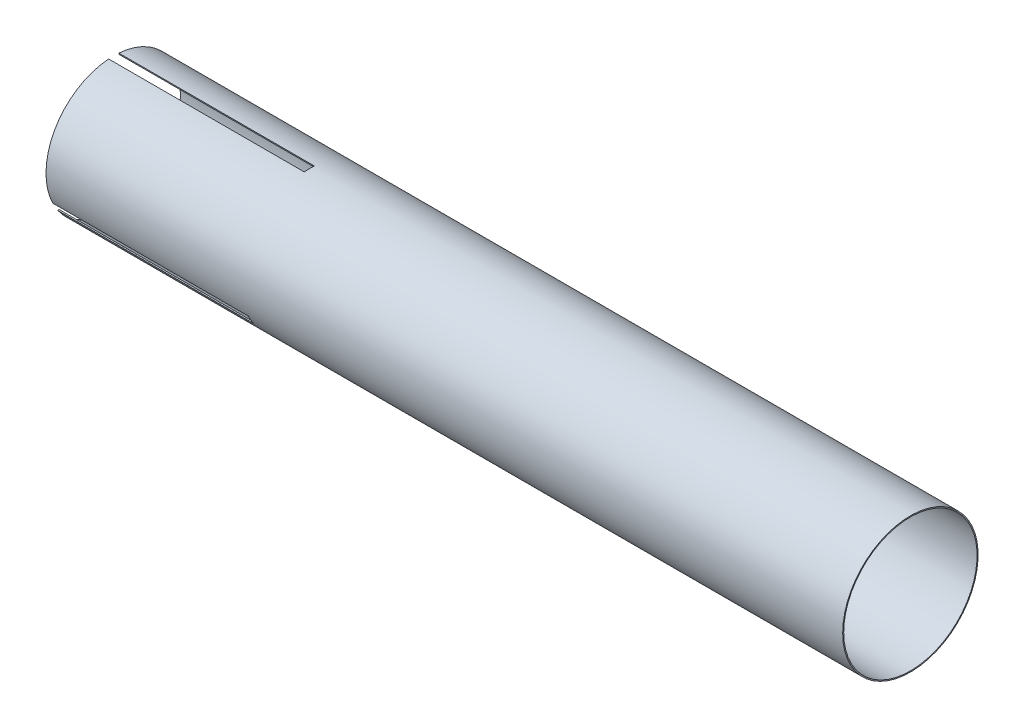
ISO-10303-21;
HEADER;
FILE_DESCRIPTION(('STEP AP214'),'2;1');
FILE_NAME('part.step','',(''),(''),'','','');
FILE_SCHEMA(('AUTOMOTIVE_DESIGN { 1 0 10303 214 1 1 1 1 }'));
ENDSEC;
DATA;
#1=APPLICATION_CONTEXT('core data for automotive mechanical design processes');
#2=APPLICATION_PROTOCOL_DEFINITION('international standard','automotive_design',2000,#1);
#3=PRODUCT_CONTEXT('',#1,'mechanical');
#4=PRODUCT('Part','Part','',(#3));
#5=PRODUCT_RELATED_PRODUCT_CATEGORY('part','',(#4));
#6=PRODUCT_DEFINITION_FORMATION('','',#4);
#7=PRODUCT_DEFINITION_CONTEXT('part definition',#1,'design');
#8=PRODUCT_DEFINITION('design','',#6,#7);
#9=PRODUCT_DEFINITION_SHAPE('','',#8);
#10=(LENGTH_UNIT() NAMED_UNIT(*) SI_UNIT(.MILLI.,.METRE.));
#11=(NAMED_UNIT(*) PLANE_ANGLE_UNIT() SI_UNIT($,.RADIAN.));
#12=(NAMED_UNIT(*) SI_UNIT($,.STERADIAN.) SOLID_ANGLE_UNIT());
#13=UNCERTAINTY_MEASURE_WITH_UNIT(LENGTH_MEASURE(1.E-05),#10,'distance_accuracy_value','');
#14=(GEOMETRIC_REPRESENTATION_CONTEXT(3) GLOBAL_UNCERTAINTY_ASSIGNED_CONTEXT((#13)) GLOBAL_UNIT_ASSIGNED_CONTEXT((#10,
#11,#12)) REPRESENTATION_CONTEXT('',''));
#15=CARTESIAN_POINT('',(0.,0.,0.));
#16=DIRECTION('',(0.,0.,1.));
#17=DIRECTION('',(1.,0.,0.));
#18=AXIS2_PLACEMENT_3D('',#15,#16,#17);
#19=CARTESIAN_POINT('',(0.,76.182,0.));
#20=DIRECTION('',(1.,0.,0.));
#21=DIRECTION('',(0.,0.,-1.));
#22=AXIS2_PLACEMENT_3D('',#19,#20,#21);
#23=PLANE('',#22);
#24=DIRECTION('',(0.,0.500000000000004,0.866025403784436));
#25=VECTOR('',#24,1.);
#26=CARTESIAN_POINT('',(0.,-57.0051254986801,-87.2537736555529));
#27=LINE('',#26,#25);
#28=CARTESIAN_POINT('',(0.,-42.9545388300949,-62.9174436694139));
#29=VERTEX_POINT('',#28);
#30=CARTESIAN_POINT('',(0.,-42.361826833089,-61.890836376344));
#31=VERTEX_POINT('',#30);
#32=EDGE_CURVE('E203',#29,#31,#27,.T.);
#33=ORIENTED_EDGE('',*,*,#32,.F.);
#34=CARTESIAN_POINT('',(0.,0.,0.));
#35=DIRECTION('',(-1.,0.,0.));
#36=DIRECTION('',(0.,0.,1.));
#37=AXIS2_PLACEMENT_3D('',#34,#35,#36);
#38=CIRCLE('',#37,76.182);
#39=CARTESIAN_POINT('',(0.,-42.954538830094,62.9174436694145));
#40=VERTEX_POINT('',#39);
#41=EDGE_CURVE('E147',#29,#40,#38,.T.);
#42=ORIENTED_EDGE('',*,*,#41,.T.);
#43=DIRECTION('',(0.,0.499999999999991,-0.866025403784444));
#44=VECTOR('',#43,1.);
#45=CARTESIAN_POINT('',(0.,-57.0051254986785,87.2537736555534));
#46=LINE('',#45,#44);
#47=CARTESIAN_POINT('',(0.,-42.3618268330881,61.8908363763446));
#48=VERTEX_POINT('',#47);
#49=EDGE_CURVE('E210',#40,#48,#46,.T.);
#50=ORIENTED_EDGE('',*,*,#49,.T.);
#51=CARTESIAN_POINT('',(0.,0.,0.));
#52=DIRECTION('',(-1.,0.,0.));
#53=DIRECTION('',(0.,0.,1.));
#54=AXIS2_PLACEMENT_3D('',#51,#52,#53);
#55=CIRCLE('',#54,75.);
#56=EDGE_CURVE('E176',#31,#48,#55,.T.);
#57=ORIENTED_EDGE('',*,*,#56,.F.);
#58=EDGE_LOOP('',(#33,#42,#50,#57));
#59=FACE_BOUND('',#58,.T.);
#60=ADVANCED_FACE('F37',(#59),#23,.F.);
#61=DIRECTION('',(0.,0.500000000000004,0.866025403784436));
#62=VECTOR('',#61,1.);
#63=CARTESIAN_POINT('',(0.,-47.0614218124272,-92.994773655553));
#64=LINE('',#63,#62);
#65=CARTESIAN_POINT('',(0.,-33.010835143842,-68.6584436694139));
#66=VERTEX_POINT('',#65);
#67=CARTESIAN_POINT('',(0.,-32.4181231468361,-67.631836376344));
#68=VERTEX_POINT('',#67);
#69=EDGE_CURVE('E218',#66,#68,#64,.T.);
#70=ORIENTED_EDGE('',*,*,#69,.T.);
#71=CARTESIAN_POINT('',(0.,74.7799499799244,-5.741));
#72=VERTEX_POINT('',#71);
#73=EDGE_CURVE('E172',#72,#68,#55,.T.);
#74=ORIENTED_EDGE('',*,*,#73,.F.);
#75=DIRECTION('',(0.,-1.,0.));
#76=VECTOR('',#75,1.);
#77=CARTESIAN_POINT('',(0.,76.182,-5.741));
#78=LINE('',#77,#76);
#79=CARTESIAN_POINT('',(0.,75.9653739739363,-5.741));
#80=VERTEX_POINT('',#79);
#81=EDGE_CURVE('E230',#80,#72,#78,.T.);
#82=ORIENTED_EDGE('',*,*,#81,.F.);
#83=EDGE_CURVE('E150',#80,#66,#38,.T.);
#84=ORIENTED_EDGE('',*,*,#83,.T.);
#85=EDGE_LOOP('',(#70,#74,#82,#84));
#86=FACE_BOUND('',#85,.T.);
#87=ADVANCED_FACE('F259',(#86),#23,.F.);
#88=DIRECTION('',(0.,0.499999999999991,-0.866025403784444));
#89=VECTOR('',#88,1.);
#90=CARTESIAN_POINT('',(0.,-47.0614218124255,92.9947736555533));
#91=LINE('',#90,#89);
#92=CARTESIAN_POINT('',(0.,-33.010835143841,68.6584436694144));
#93=VERTEX_POINT('',#92);
#94=CARTESIAN_POINT('',(0.,-32.4181231468351,67.6318363763445));
#95=VERTEX_POINT('',#94);
#96=EDGE_CURVE('E126',#93,#95,#91,.T.);
#97=ORIENTED_EDGE('',*,*,#96,.F.);
#98=CARTESIAN_POINT('',(0.,75.9653739739363,5.741));
#99=VERTEX_POINT('',#98);
#100=EDGE_CURVE('E138',#93,#99,#38,.T.);
#101=ORIENTED_EDGE('',*,*,#100,.T.);
#102=DIRECTION('',(0.,-1.,0.));
#103=VECTOR('',#102,1.);
#104=CARTESIAN_POINT('',(0.,76.182,5.741));
#105=LINE('',#104,#103);
#106=CARTESIAN_POINT('',(0.,74.7799499799244,5.741));
#107=VERTEX_POINT('',#106);
#108=EDGE_CURVE('E238',#99,#107,#105,.T.);
#109=ORIENTED_EDGE('',*,*,#108,.T.);
#110=EDGE_CURVE('E140',#95,#107,#55,.T.);
#111=ORIENTED_EDGE('',*,*,#110,.F.);
#112=EDGE_LOOP('',(#97,#101,#109,#111));
#113=FACE_BOUND('',#112,.T.);
#114=ADVANCED_FACE('F136',(#113),#23,.F.);
#115=CARTESIAN_POINT('',(0.,0.,0.));
#116=DIRECTION('',(-1.,0.,0.));
#117=DIRECTION('',(0.,0.,1.));
#118=AXIS2_PLACEMENT_3D('',#115,#116,#117);
#119=CYLINDRICAL_SURFACE('',#118,75.);
#120=CARTESIAN_POINT('',(896.,0.,0.));
#121=DIRECTION('',(-1.,0.,0.));
#122=DIRECTION('',(0.,0.,1.));
#123=AXIS2_PLACEMENT_3D('',#120,#121,#122);
#124=CIRCLE('',#123,75.);
#125=CARTESIAN_POINT('',(896.,0.,75.));
#126=VERTEX_POINT('',#125);
#127=EDGE_CURVE('E166',#126,#126,#124,.T.);
#128=ORIENTED_EDGE('',*,*,#127,.F.);
#129=EDGE_LOOP('',(#128));
#130=FACE_BOUND('',#129,.T.);
#131=DIRECTION('',(-1.,0.,0.));
#132=VECTOR('',#131,1.);
#133=CARTESIAN_POINT('',(0.,-42.361826833089,-61.890836376344));
#134=LINE('',#133,#132);
#135=CARTESIAN_POINT('',(220.,-42.361826833089,-61.890836376344));
#136=VERTEX_POINT('',#135);
#137=EDGE_CURVE('E202',#31,#136,#134,.F.);
#138=ORIENTED_EDGE('',*,*,#137,.F.);
#139=ORIENTED_EDGE('',*,*,#56,.T.);
#140=DIRECTION('',(-1.,0.,0.));
#141=VECTOR('',#140,1.);
#142=CARTESIAN_POINT('',(0.,-42.3618268330881,61.8908363763446));
#143=LINE('',#142,#141);
#144=CARTESIAN_POINT('',(220.,-42.3618268330881,61.8908363763446));
#145=VERTEX_POINT('',#144);
#146=EDGE_CURVE('E222',#145,#48,#143,.T.);
#147=ORIENTED_EDGE('',*,*,#146,.F.);
#148=CARTESIAN_POINT('',(220.,0.,0.));
#149=DIRECTION('',(-1.,0.,0.));
#150=DIRECTION('',(0.,0.,1.));
#151=AXIS2_PLACEMENT_3D('',#148,#149,#150);
#152=CIRCLE('',#151,75.);
#153=CARTESIAN_POINT('',(220.,-32.4181231468351,67.6318363763445));
#154=VERTEX_POINT('',#153);
#155=EDGE_CURVE('E226',#154,#145,#152,.F.);
#156=ORIENTED_EDGE('',*,*,#155,.F.);
#157=DIRECTION('',(-1.,0.,0.));
#158=VECTOR('',#157,1.);
#159=CARTESIAN_POINT('',(0.,-32.4181231468351,67.6318363763445));
#160=LINE('',#159,#158);
#161=EDGE_CURVE('E220',#95,#154,#160,.F.);
#162=ORIENTED_EDGE('',*,*,#161,.F.);
#163=ORIENTED_EDGE('',*,*,#110,.T.);
#164=DIRECTION('',(-1.,0.,0.));
#165=VECTOR('',#164,1.);
#166=CARTESIAN_POINT('',(0.,74.7799499799244,5.741));
#167=LINE('',#166,#165);
#168=CARTESIAN_POINT('',(220.,74.7799499799244,5.741));
#169=VERTEX_POINT('',#168);
#170=EDGE_CURVE('E148',#169,#107,#167,.T.);
#171=ORIENTED_EDGE('',*,*,#170,.F.);
#172=CARTESIAN_POINT('',(220.,0.,0.));
#173=DIRECTION('',(-1.,0.,0.));
#174=DIRECTION('',(0.,0.,1.));
#175=AXIS2_PLACEMENT_3D('',#172,#173,#174);
#176=CIRCLE('',#175,75.);
#177=CARTESIAN_POINT('',(220.,74.7799499799244,-5.741));
#178=VERTEX_POINT('',#177);
#179=EDGE_CURVE('E156',#178,#169,#176,.F.);
#180=ORIENTED_EDGE('',*,*,#179,.F.);
#181=DIRECTION('',(-1.,0.,0.));
#182=VECTOR('',#181,1.);
#183=CARTESIAN_POINT('',(0.,74.7799499799244,-5.741));
#184=LINE('',#183,#182);
#185=EDGE_CURVE('E240',#72,#178,#184,.F.);
#186=ORIENTED_EDGE('',*,*,#185,.F.);
#187=ORIENTED_EDGE('',*,*,#73,.T.);
#188=DIRECTION('',(-1.,0.,0.));
#189=VECTOR('',#188,1.);
#190=CARTESIAN_POINT('',(0.,-32.4181231468361,-67.631836376344));
#191=LINE('',#190,#189);
#192=CARTESIAN_POINT('',(220.,-32.4181231468361,-67.631836376344));
#193=VERTEX_POINT('',#192);
#194=EDGE_CURVE('E227',#193,#68,#191,.T.);
#195=ORIENTED_EDGE('',*,*,#194,.F.);
#196=EDGE_CURVE('E224',#136,#193,#152,.F.);
#197=ORIENTED_EDGE('',*,*,#196,.F.);
#198=EDGE_LOOP('',(#138,#139,#147,#156,#162,#163,#171,#180,#186,#187,#195,#197));
#199=FACE_BOUND('',#198,.T.);
#200=ADVANCED_FACE('F252',(#130,#199),#119,.F.);
#201=CARTESIAN_POINT('',(0.,0.,0.));
#202=DIRECTION('',(-1.,0.,0.));
#203=DIRECTION('',(0.,0.,1.));
#204=AXIS2_PLACEMENT_3D('',#201,#202,#203);
#205=CYLINDRICAL_SURFACE('',#204,76.182);
#206=CARTESIAN_POINT('',(896.,0.,0.));
#207=DIRECTION('',(-1.,0.,0.));
#208=DIRECTION('',(0.,0.,1.));
#209=AXIS2_PLACEMENT_3D('',#206,#207,#208);
#210=CIRCLE('',#209,76.182);
#211=CARTESIAN_POINT('',(896.,0.,76.182));
#212=VERTEX_POINT('',#211);
#213=EDGE_CURVE('E160',#212,#212,#210,.T.);
#214=ORIENTED_EDGE('',*,*,#213,.T.);
#215=EDGE_LOOP('',(#214));
#216=FACE_BOUND('',#215,.T.);
#217=DIRECTION('',(-1.,0.,0.));
#218=VECTOR('',#217,1.);
#219=CARTESIAN_POINT('',(0.,-42.9545388300949,-62.9174436694139));
#220=LINE('',#219,#218);
#221=CARTESIAN_POINT('',(220.,-42.9545388300949,-62.9174436694139));
#222=VERTEX_POINT('',#221);
#223=EDGE_CURVE('E11',#222,#29,#220,.T.);
#224=ORIENTED_EDGE('',*,*,#223,.F.);
#225=CARTESIAN_POINT('',(220.,0.,0.));
#226=DIRECTION('',(-1.,0.,0.));
#227=DIRECTION('',(0.,0.,1.));
#228=AXIS2_PLACEMENT_3D('',#225,#226,#227);
#229=CIRCLE('',#228,76.182);
#230=CARTESIAN_POINT('',(220.,-33.010835143842,-68.6584436694139));
#231=VERTEX_POINT('',#230);
#232=EDGE_CURVE('E186',#231,#222,#229,.T.);
#233=ORIENTED_EDGE('',*,*,#232,.F.);
#234=DIRECTION('',(-1.,0.,0.));
#235=VECTOR('',#234,1.);
#236=CARTESIAN_POINT('',(0.,-33.010835143842,-68.6584436694139));
#237=LINE('',#236,#235);
#238=EDGE_CURVE('E45',#66,#231,#237,.F.);
#239=ORIENTED_EDGE('',*,*,#238,.F.);
#240=ORIENTED_EDGE('',*,*,#83,.F.);
#241=DIRECTION('',(-1.,0.,0.));
#242=VECTOR('',#241,1.);
#243=CARTESIAN_POINT('',(0.,75.9653739739363,-5.741));
#244=LINE('',#243,#242);
#245=CARTESIAN_POINT('',(220.,75.9653739739363,-5.741));
#246=VERTEX_POINT('',#245);
#247=EDGE_CURVE('E179',#246,#80,#244,.T.);
#248=ORIENTED_EDGE('',*,*,#247,.F.);
#249=CARTESIAN_POINT('',(220.,0.,0.));
#250=DIRECTION('',(-1.,0.,0.));
#251=DIRECTION('',(0.,0.,1.));
#252=AXIS2_PLACEMENT_3D('',#249,#250,#251);
#253=CIRCLE('',#252,76.182);
#254=CARTESIAN_POINT('',(220.,75.9653739739363,5.741));
#255=VERTEX_POINT('',#254);
#256=EDGE_CURVE('E175',#255,#246,#253,.T.);
#257=ORIENTED_EDGE('',*,*,#256,.F.);
#258=DIRECTION('',(-1.,0.,0.));
#259=VECTOR('',#258,1.);
#260=CARTESIAN_POINT('',(0.,75.9653739739363,5.741));
#261=LINE('',#260,#259);
#262=EDGE_CURVE('E132',#99,#255,#261,.F.);
#263=ORIENTED_EDGE('',*,*,#262,.F.);
#264=ORIENTED_EDGE('',*,*,#100,.F.);
#265=DIRECTION('',(-1.,0.,0.));
#266=VECTOR('',#265,1.);
#267=CARTESIAN_POINT('',(0.,-33.010835143841,68.6584436694144));
#268=LINE('',#267,#266);
#269=CARTESIAN_POINT('',(220.,-33.010835143841,68.6584436694144));
#270=VERTEX_POINT('',#269);
#271=EDGE_CURVE('E123',#270,#93,#268,.T.);
#272=ORIENTED_EDGE('',*,*,#271,.F.);
#273=CARTESIAN_POINT('',(220.,-42.954538830094,62.9174436694145));
#274=VERTEX_POINT('',#273);
#275=EDGE_CURVE('E131',#274,#270,#229,.T.);
#276=ORIENTED_EDGE('',*,*,#275,.F.);
#277=DIRECTION('',(-1.,0.,0.));
#278=VECTOR('',#277,1.);
#279=CARTESIAN_POINT('',(0.,-42.954538830094,62.9174436694145));
#280=LINE('',#279,#278);
#281=EDGE_CURVE('E185',#40,#274,#280,.F.);
#282=ORIENTED_EDGE('',*,*,#281,.F.);
#283=ORIENTED_EDGE('',*,*,#41,.F.);
#284=EDGE_LOOP('',(#224,#233,#239,#240,#248,#257,#263,#264,#272,#276,#282,#283));
#285=FACE_BOUND('',#284,.T.);
#286=ADVANCED_FACE('F144',(#216,#285),#205,.T.);
#287=CARTESIAN_POINT('',(896.,76.182,0.));
#288=DIRECTION('',(-1.,0.,0.));
#289=DIRECTION('',(0.,0.,1.));
#290=AXIS2_PLACEMENT_3D('',#287,#288,#289);
#291=PLANE('',#290);
#292=ORIENTED_EDGE('',*,*,#213,.F.);
#293=EDGE_LOOP('',(#292));
#294=FACE_BOUND('',#293,.T.);
#295=ORIENTED_EDGE('',*,*,#127,.T.);
#296=EDGE_LOOP('',(#295));
#297=FACE_BOUND('',#296,.T.);
#298=ADVANCED_FACE('F286',(#294,#297),#291,.F.);
#299=CARTESIAN_POINT('',(0.,76.182,5.741));
#300=DIRECTION('',(0.,0.,-1.));
#301=DIRECTION('',(-1.,0.,0.));
#302=AXIS2_PLACEMENT_3D('',#299,#300,#301);
#303=PLANE('',#302);
#304=ORIENTED_EDGE('',*,*,#170,.T.);
#305=ORIENTED_EDGE('',*,*,#108,.F.);
#306=ORIENTED_EDGE('',*,*,#262,.T.);
#307=DIRECTION('',(0.,-1.,0.));
#308=VECTOR('',#307,1.);
#309=CARTESIAN_POINT('',(220.,76.182,5.741));
#310=LINE('',#309,#308);
#311=EDGE_CURVE('E235',#255,#169,#310,.T.);
#312=ORIENTED_EDGE('',*,*,#311,.T.);
#313=EDGE_LOOP('',(#304,#305,#306,#312));
#314=FACE_BOUND('',#313,.T.);
#315=ADVANCED_FACE('F251',(#314),#303,.T.);
#316=CARTESIAN_POINT('',(220.,76.182,5.741));
#317=DIRECTION('',(-1.,0.,0.));
#318=DIRECTION('',(0.,0.,1.));
#319=AXIS2_PLACEMENT_3D('',#316,#317,#318);
#320=PLANE('',#319);
#321=ORIENTED_EDGE('',*,*,#179,.T.);
#322=ORIENTED_EDGE('',*,*,#311,.F.);
#323=ORIENTED_EDGE('',*,*,#256,.T.);
#324=DIRECTION('',(0.,-1.,0.));
#325=VECTOR('',#324,1.);
#326=CARTESIAN_POINT('',(220.,76.182,-5.741));
#327=LINE('',#326,#325);
#328=EDGE_CURVE('E232',#246,#178,#327,.T.);
#329=ORIENTED_EDGE('',*,*,#328,.T.);
#330=EDGE_LOOP('',(#321,#322,#323,#329));
#331=FACE_BOUND('',#330,.T.);
#332=ADVANCED_FACE('F246',(#331),#320,.T.);
#333=CARTESIAN_POINT('',(0.,76.182,-5.741));
#334=DIRECTION('',(0.,0.,1.));
#335=DIRECTION('',(1.,0.,0.));
#336=AXIS2_PLACEMENT_3D('',#333,#334,#335);
#337=PLANE('',#336);
#338=ORIENTED_EDGE('',*,*,#185,.T.);
#339=ORIENTED_EDGE('',*,*,#328,.F.);
#340=ORIENTED_EDGE('',*,*,#247,.T.);
#341=ORIENTED_EDGE('',*,*,#81,.T.);
#342=EDGE_LOOP('',(#338,#339,#340,#341));
#343=FACE_BOUND('',#342,.T.);
#344=ADVANCED_FACE('F261',(#343),#337,.T.);
#345=CARTESIAN_POINT('',(0.,-57.0051254986785,87.2537736555534));
#346=DIRECTION('',(0.,0.866025403784444,0.499999999999991));
#347=DIRECTION('',(0.,-0.499999999999991,0.866025403784444));
#348=AXIS2_PLACEMENT_3D('',#345,#346,#347);
#349=PLANE('',#348);
#350=ORIENTED_EDGE('',*,*,#146,.T.);
#351=ORIENTED_EDGE('',*,*,#49,.F.);
#352=ORIENTED_EDGE('',*,*,#281,.T.);
#353=DIRECTION('',(0.,0.499999999999991,-0.866025403784444));
#354=VECTOR('',#353,1.);
#355=CARTESIAN_POINT('',(220.,-57.0051254986785,87.2537736555534));
#356=LINE('',#355,#354);
#357=EDGE_CURVE('E213',#274,#145,#356,.T.);
#358=ORIENTED_EDGE('',*,*,#357,.T.);
#359=EDGE_LOOP('',(#350,#351,#352,#358));
#360=FACE_BOUND('',#359,.T.);
#361=ADVANCED_FACE('F264',(#360),#349,.T.);
#362=CARTESIAN_POINT('',(0.,-47.0614218124255,92.9947736555533));
#363=DIRECTION('',(0.,-0.866025403784444,-0.499999999999991));
#364=DIRECTION('',(0.,0.499999999999991,-0.866025403784444));
#365=AXIS2_PLACEMENT_3D('',#362,#363,#364);
#366=PLANE('',#365);
#367=ORIENTED_EDGE('',*,*,#161,.T.);
#368=DIRECTION('',(0.,0.499999999999991,-0.866025403784444));
#369=VECTOR('',#368,1.);
#370=CARTESIAN_POINT('',(220.,-47.0614218124255,92.9947736555533));
#371=LINE('',#370,#369);
#372=EDGE_CURVE('E60',#270,#154,#371,.T.);
#373=ORIENTED_EDGE('',*,*,#372,.F.);
#374=ORIENTED_EDGE('',*,*,#271,.T.);
#375=ORIENTED_EDGE('',*,*,#96,.T.);
#376=EDGE_LOOP('',(#367,#373,#374,#375));
#377=FACE_BOUND('',#376,.T.);
#378=ADVANCED_FACE('F125',(#377),#366,.T.);
#379=CARTESIAN_POINT('',(220.,-47.0614218124272,-92.994773655553));
#380=DIRECTION('',(-1.,0.,0.));
#381=DIRECTION('',(0.,0.,1.));
#382=AXIS2_PLACEMENT_3D('',#379,#380,#381);
#383=PLANE('',#382);
#384=ORIENTED_EDGE('',*,*,#155,.T.);
#385=ORIENTED_EDGE('',*,*,#357,.F.);
#386=ORIENTED_EDGE('',*,*,#275,.T.);
#387=ORIENTED_EDGE('',*,*,#372,.T.);
#388=EDGE_LOOP('',(#384,#385,#386,#387));
#389=FACE_BOUND('',#388,.T.);
#390=ADVANCED_FACE('F347',(#389),#383,.T.);
#391=CARTESIAN_POINT('',(0.,-57.0051254986801,-87.2537736555529));
#392=DIRECTION('',(0.,0.866025403784436,-0.500000000000004));
#393=DIRECTION('',(0.,0.500000000000004,0.866025403784436));
#394=AXIS2_PLACEMENT_3D('',#391,#392,#393);
#395=PLANE('',#394);
#396=ORIENTED_EDGE('',*,*,#137,.T.);
#397=DIRECTION('',(0.,0.500000000000004,0.866025403784436));
#398=VECTOR('',#397,1.);
#399=CARTESIAN_POINT('',(220.,-57.0051254986801,-87.2537736555529));
#400=LINE('',#399,#398);
#401=EDGE_CURVE('E196',#222,#136,#400,.T.);
#402=ORIENTED_EDGE('',*,*,#401,.F.);
#403=ORIENTED_EDGE('',*,*,#223,.T.);
#404=ORIENTED_EDGE('',*,*,#32,.T.);
#405=EDGE_LOOP('',(#396,#402,#403,#404));
#406=FACE_BOUND('',#405,.T.);
#407=ADVANCED_FACE('F199',(#406),#395,.T.);
#408=CARTESIAN_POINT('',(0.,-47.0614218124272,-92.994773655553));
#409=DIRECTION('',(0.,-0.866025403784436,0.500000000000004));
#410=DIRECTION('',(0.,-0.500000000000004,-0.866025403784436));
#411=AXIS2_PLACEMENT_3D('',#408,#409,#410);
#412=PLANE('',#411);
#413=ORIENTED_EDGE('',*,*,#194,.T.);
#414=ORIENTED_EDGE('',*,*,#69,.F.);
#415=ORIENTED_EDGE('',*,*,#238,.T.);
#416=DIRECTION('',(0.,0.500000000000004,0.866025403784436));
#417=VECTOR('',#416,1.);
#418=CARTESIAN_POINT('',(220.,-47.0614218124272,-92.994773655553));
#419=LINE('',#418,#417);
#420=EDGE_CURVE('E52',#231,#193,#419,.T.);
#421=ORIENTED_EDGE('',*,*,#420,.T.);
#422=EDGE_LOOP('',(#413,#414,#415,#421));
#423=FACE_BOUND('',#422,.T.);
#424=ADVANCED_FACE('F257',(#423),#412,.T.);
#425=ORIENTED_EDGE('',*,*,#196,.T.);
#426=ORIENTED_EDGE('',*,*,#420,.F.);
#427=ORIENTED_EDGE('',*,*,#232,.T.);
#428=ORIENTED_EDGE('',*,*,#401,.T.);
#429=EDGE_LOOP('',(#425,#426,#427,#428));
#430=FACE_BOUND('',#429,.T.);
#431=ADVANCED_FACE('F195',(#430),#383,.T.);
#432=CLOSED_SHELL('',(#60,#87,#114,#200,#286,#298,#315,#332,#344,#361,#378,#390,#407,#424,#431));
#433=MANIFOLD_SOLID_BREP('B2',#432);
#434=ADVANCED_BREP_SHAPE_REPRESENTATION('',(#18,#433),#14);
#435=SHAPE_DEFINITION_REPRESENTATION(#9,#434);
ENDSEC;
END-ISO-10303-21;
